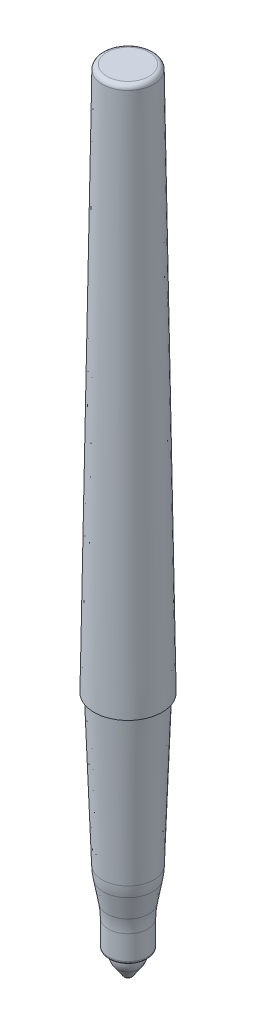
ISO-10303-21;
HEADER;
FILE_DESCRIPTION(('STEP AP214'),'2;1');
FILE_NAME('part.step','',(''),(''),'','','');
FILE_SCHEMA(('AUTOMOTIVE_DESIGN { 1 0 10303 214 1 1 1 1 }'));
ENDSEC;
DATA;
#1=APPLICATION_CONTEXT('core data for automotive mechanical design processes');
#2=APPLICATION_PROTOCOL_DEFINITION('international standard','automotive_design',2000,#1);
#3=PRODUCT_CONTEXT('',#1,'mechanical');
#4=PRODUCT('Part','Part','',(#3));
#5=PRODUCT_RELATED_PRODUCT_CATEGORY('part','',(#4));
#6=PRODUCT_DEFINITION_FORMATION('','',#4);
#7=PRODUCT_DEFINITION_CONTEXT('part definition',#1,'design');
#8=PRODUCT_DEFINITION('design','',#6,#7);
#9=PRODUCT_DEFINITION_SHAPE('','',#8);
#10=(LENGTH_UNIT() NAMED_UNIT(*) SI_UNIT(.MILLI.,.METRE.));
#11=(NAMED_UNIT(*) PLANE_ANGLE_UNIT() SI_UNIT($,.RADIAN.));
#12=(NAMED_UNIT(*) SI_UNIT($,.STERADIAN.) SOLID_ANGLE_UNIT());
#13=UNCERTAINTY_MEASURE_WITH_UNIT(LENGTH_MEASURE(1.E-05),#10,'distance_accuracy_value','');
#14=(GEOMETRIC_REPRESENTATION_CONTEXT(3) GLOBAL_UNCERTAINTY_ASSIGNED_CONTEXT((#13)) GLOBAL_UNIT_ASSIGNED_CONTEXT((#10,
#11,#12)) REPRESENTATION_CONTEXT('',''));
#15=CARTESIAN_POINT('',(0.,0.,0.));
#16=DIRECTION('',(0.,0.,1.));
#17=DIRECTION('',(1.,0.,0.));
#18=AXIS2_PLACEMENT_3D('',#15,#16,#17);
#19=CARTESIAN_POINT('',(0.,129.54,0.));
#20=DIRECTION('',(0.,-1.,0.));
#21=DIRECTION('',(0.,0.,-1.));
#22=AXIS2_PLACEMENT_3D('',#19,#20,#21);
#23=CONICAL_SURFACE('',#22,4.191,0.0156459493613127);
#24=CARTESIAN_POINT('',(0.,128.789921727001,0.));
#25=DIRECTION('',(0.,1.,0.));
#26=DIRECTION('',(0.,0.,1.));
#27=AXIS2_PLACEMENT_3D('',#24,#25,#26);
#28=CIRCLE('',#27,4.20273664438547);
#29=CARTESIAN_POINT('',(0.,128.789921727001,4.20273664438547));
#30=VERTEX_POINT('',#29);
#31=EDGE_CURVE('E39',#30,#30,#28,.F.);
#32=ORIENTED_EDGE('',*,*,#31,.T.);
#33=EDGE_LOOP('',(#32));
#34=FACE_BOUND('',#33,.T.);
#35=CARTESIAN_POINT('',(0.,40.259,0.));
#36=DIRECTION('',(0.,-1.,0.));
#37=DIRECTION('',(0.,0.,-1.));
#38=AXIS2_PLACEMENT_3D('',#35,#36,#37);
#39=CIRCLE('',#38,5.588);
#40=CARTESIAN_POINT('',(0.,40.259,-5.588));
#41=VERTEX_POINT('',#40);
#42=EDGE_CURVE('E82',#41,#41,#39,.T.);
#43=ORIENTED_EDGE('',*,*,#42,.F.);
#44=EDGE_LOOP('',(#43));
#45=FACE_BOUND('',#44,.T.);
#46=ADVANCED_FACE('F32',(#34,#45),#23,.T.);
#47=CARTESIAN_POINT('',(0.,129.54,0.));
#48=DIRECTION('',(0.,-1.,0.));
#49=DIRECTION('',(0.,0.,-1.));
#50=AXIS2_PLACEMENT_3D('',#47,#48,#49);
#51=PLANE('',#50);
#52=CARTESIAN_POINT('',(0.,129.54,0.));
#53=DIRECTION('',(0.,-1.,0.));
#54=DIRECTION('',(0.,0.,-1.));
#55=AXIS2_PLACEMENT_3D('',#52,#53,#54);
#56=CIRCLE('',#55,3.44082990965654);
#57=CARTESIAN_POINT('',(0.,129.54,-3.44082990965654));
#58=VERTEX_POINT('',#57);
#59=EDGE_CURVE('E10',#58,#58,#56,.F.);
#60=ORIENTED_EDGE('',*,*,#59,.T.);
#61=EDGE_LOOP('',(#60));
#62=FACE_BOUND('',#61,.T.);
#63=ADVANCED_FACE('F90',(#62),#51,.F.);
#64=CARTESIAN_POINT('',(0.,0.,0.));
#65=DIRECTION('',(0.,-1.,0.));
#66=DIRECTION('',(0.,0.,-1.));
#67=AXIS2_PLACEMENT_3D('',#64,#65,#66);
#68=PLANE('',#67);
#69=CARTESIAN_POINT('',(0.,0.,0.));
#70=DIRECTION('',(0.,-1.,0.));
#71=DIRECTION('',(0.,0.,-1.));
#72=AXIS2_PLACEMENT_3D('',#69,#70,#71);
#73=CIRCLE('',#72,0.243506974720728);
#74=CARTESIAN_POINT('',(0.,0.,-0.243506974720728));
#75=VERTEX_POINT('',#74);
#76=EDGE_CURVE('E73',#75,#75,#73,.T.);
#77=ORIENTED_EDGE('',*,*,#76,.T.);
#78=EDGE_LOOP('',(#77));
#79=FACE_BOUND('',#78,.T.);
#80=ADVANCED_FACE('F95',(#79),#68,.T.);
#81=CARTESIAN_POINT('',(0.,0.,0.));
#82=DIRECTION('',(0.,1.,0.));
#83=DIRECTION('',(0.,0.,1.));
#84=AXIS2_PLACEMENT_3D('',#81,#82,#83);
#85=CONICAL_SURFACE('',#84,0.508,0.610725964389209);
#86=CARTESIAN_POINT('',(0.,1.88407011159766,0.));
#87=DIRECTION('',(0.,-1.,0.));
#88=DIRECTION('',(0.,0.,-1.));
#89=AXIS2_PLACEMENT_3D('',#86,#87,#88);
#90=CIRCLE('',#89,1.82684907811836);
#91=CARTESIAN_POINT('',(0.,1.88407011159766,-1.82684907811836));
#92=VERTEX_POINT('',#91);
#93=EDGE_CURVE('E67',#92,#92,#90,.T.);
#94=ORIENTED_EDGE('',*,*,#93,.T.);
#95=EDGE_LOOP('',(#94));
#96=FACE_BOUND('',#95,.T.);
#97=CARTESIAN_POINT('',(0.,0.216681129063429,0.));
#98=DIRECTION('',(0.,-1.,0.));
#99=DIRECTION('',(0.,0.,-1.));
#100=AXIS2_PLACEMENT_3D('',#97,#98,#99);
#101=CIRCLE('',#100,0.659676790344401);
#102=CARTESIAN_POINT('',(0.,0.216681129063429,-0.659676790344401));
#103=VERTEX_POINT('',#102);
#104=EDGE_CURVE('E70',#103,#103,#101,.F.);
#105=ORIENTED_EDGE('',*,*,#104,.T.);
#106=EDGE_LOOP('',(#105));
#107=FACE_BOUND('',#106,.T.);
#108=ADVANCED_FACE('F134',(#96,#107),#85,.T.);
#109=CARTESIAN_POINT('',(0.,0.,0.));
#110=DIRECTION('',(0.,-1.,0.));
#111=DIRECTION('',(0.,0.,-1.));
#112=AXIS2_PLACEMENT_3D('',#109,#110,#111);
#113=CYLINDRICAL_SURFACE('',#112,2.286);
#114=CARTESIAN_POINT('',(0.,3.34066446628052,0.));
#115=DIRECTION('',(0.,1.,0.));
#116=DIRECTION('',(0.,0.,1.));
#117=AXIS2_PLACEMENT_3D('',#114,#115,#116);
#118=CIRCLE('',#117,2.286);
#119=CARTESIAN_POINT('',(0.,3.34066446628052,2.286));
#120=VERTEX_POINT('',#119);
#121=EDGE_CURVE('E64',#120,#120,#118,.T.);
#122=ORIENTED_EDGE('',*,*,#121,.T.);
#123=EDGE_LOOP('',(#122));
#124=FACE_BOUND('',#123,.T.);
#125=CARTESIAN_POINT('',(0.,3.81,0.));
#126=DIRECTION('',(0.,-1.,0.));
#127=DIRECTION('',(0.,0.,-1.));
#128=AXIS2_PLACEMENT_3D('',#125,#126,#127);
#129=CIRCLE('',#128,2.286);
#130=CARTESIAN_POINT('',(0.,3.81,-2.286));
#131=VERTEX_POINT('',#130);
#132=EDGE_CURVE('E76',#131,#131,#129,.T.);
#133=ORIENTED_EDGE('',*,*,#132,.T.);
#134=EDGE_LOOP('',(#133));
#135=FACE_BOUND('',#134,.T.);
#136=ADVANCED_FACE('F129',(#124,#135),#113,.T.);
#137=CARTESIAN_POINT('',(0.,3.81,0.));
#138=DIRECTION('',(0.,-1.,0.));
#139=DIRECTION('',(0.,0.,-1.));
#140=AXIS2_PLACEMENT_3D('',#137,#138,#139);
#141=PLANE('',#140);
#142=CARTESIAN_POINT('',(0.,3.81,0.));
#143=DIRECTION('',(0.,-1.,0.));
#144=DIRECTION('',(0.,0.,-1.));
#145=AXIS2_PLACEMENT_3D('',#142,#143,#144);
#146=CIRCLE('',#145,2.7051);
#147=CARTESIAN_POINT('',(0.,3.81,-2.7051));
#148=VERTEX_POINT('',#147);
#149=EDGE_CURVE('E47',#148,#148,#146,.T.);
#150=ORIENTED_EDGE('',*,*,#149,.T.);
#151=EDGE_LOOP('',(#150));
#152=FACE_BOUND('',#151,.T.);
#153=ORIENTED_EDGE('',*,*,#132,.F.);
#154=EDGE_LOOP('',(#153));
#155=FACE_BOUND('',#154,.T.);
#156=ADVANCED_FACE('F125',(#152,#155),#141,.T.);
#157=CARTESIAN_POINT('',(0.,0.,0.));
#158=DIRECTION('',(0.,-1.,0.));
#159=DIRECTION('',(0.,0.,-1.));
#160=AXIS2_PLACEMENT_3D('',#157,#158,#159);
#161=CYLINDRICAL_SURFACE('',#160,3.2131);
#162=CARTESIAN_POINT('',(0.,4.318,0.));
#163=DIRECTION('',(0.,-1.,0.));
#164=DIRECTION('',(0.,0.,-1.));
#165=AXIS2_PLACEMENT_3D('',#162,#163,#164);
#166=CIRCLE('',#165,3.2131);
#167=CARTESIAN_POINT('',(0.,4.318,-3.2131));
#168=VERTEX_POINT('',#167);
#169=EDGE_CURVE('E43',#168,#168,#166,.F.);
#170=ORIENTED_EDGE('',*,*,#169,.T.);
#171=EDGE_LOOP('',(#170));
#172=FACE_BOUND('',#171,.T.);
#173=CARTESIAN_POINT('',(0.,8.26759405440986,0.));
#174=DIRECTION('',(0.,-1.,0.));
#175=DIRECTION('',(0.,0.,-1.));
#176=AXIS2_PLACEMENT_3D('',#173,#174,#175);
#177=CIRCLE('',#176,3.2131);
#178=CARTESIAN_POINT('',(0.,8.26759405440986,-3.2131));
#179=VERTEX_POINT('',#178);
#180=EDGE_CURVE('E52',#179,#179,#177,.T.);
#181=ORIENTED_EDGE('',*,*,#180,.T.);
#182=EDGE_LOOP('',(#181));
#183=FACE_BOUND('',#182,.T.);
#184=ADVANCED_FACE('F128',(#172,#183),#161,.T.);
#185=CARTESIAN_POINT('',(0.,9.398,0.));
#186=DIRECTION('',(0.,1.,0.));
#187=DIRECTION('',(0.,0.,1.));
#188=AXIS2_PLACEMENT_3D('',#185,#186,#187);
#189=CONICAL_SURFACE('',#188,3.2131,0.177548794944876);
#190=CARTESIAN_POINT('',(0.,13.9659464372444,0.));
#191=DIRECTION('',(0.,-1.,0.));
#192=DIRECTION('',(0.,0.,-1.));
#193=AXIS2_PLACEMENT_3D('',#190,#191,#192);
#194=CIRCLE('',#193,4.03276445838047);
#195=CARTESIAN_POINT('',(0.,13.9659464372444,-4.03276445838047));
#196=VERTEX_POINT('',#195);
#197=EDGE_CURVE('E58',#196,#196,#194,.T.);
#198=ORIENTED_EDGE('',*,*,#197,.T.);
#199=EDGE_LOOP('',(#198));
#200=FACE_BOUND('',#199,.T.);
#201=CARTESIAN_POINT('',(0.,10.5106354835664,0.));
#202=DIRECTION('',(0.,1.,0.));
#203=DIRECTION('',(0.,0.,1.));
#204=AXIS2_PLACEMENT_3D('',#201,#202,#203);
#205=CIRCLE('',#204,3.41274939903335);
#206=CARTESIAN_POINT('',(0.,10.5106354835664,3.41274939903335));
#207=VERTEX_POINT('',#206);
#208=EDGE_CURVE('E61',#207,#207,#205,.T.);
#209=ORIENTED_EDGE('',*,*,#208,.T.);
#210=EDGE_LOOP('',(#209));
#211=FACE_BOUND('',#210,.T.);
#212=ADVANCED_FACE('F176',(#200,#211),#189,.T.);
#213=CARTESIAN_POINT('',(0.,14.859,0.));
#214=DIRECTION('',(0.,1.,0.));
#215=DIRECTION('',(0.,0.,1.));
#216=AXIS2_PLACEMENT_3D('',#213,#214,#215);
#217=CONICAL_SURFACE('',#216,4.19301245490961,0.0349065850398867);
#218=CARTESIAN_POINT('',(0.,15.7657642582792,0.));
#219=DIRECTION('',(0.,-1.,0.));
#220=DIRECTION('',(0.,0.,-1.));
#221=AXIS2_PLACEMENT_3D('',#218,#219,#220);
#222=CIRCLE('',#221,4.22467736055633);
#223=CARTESIAN_POINT('',(0.,15.7657642582792,-4.22467736055633));
#224=VERTEX_POINT('',#223);
#225=EDGE_CURVE('E55',#224,#224,#222,.F.);
#226=ORIENTED_EDGE('',*,*,#225,.T.);
#227=EDGE_LOOP('',(#226));
#228=FACE_BOUND('',#227,.T.);
#229=CARTESIAN_POINT('',(0.,40.259,0.));
#230=DIRECTION('',(0.,-1.,0.));
#231=DIRECTION('',(0.,0.,-1.));
#232=AXIS2_PLACEMENT_3D('',#229,#230,#231);
#233=CIRCLE('',#232,5.08);
#234=CARTESIAN_POINT('',(0.,40.259,-5.08));
#235=VERTEX_POINT('',#234);
#236=EDGE_CURVE('E79',#235,#235,#233,.T.);
#237=ORIENTED_EDGE('',*,*,#236,.T.);
#238=EDGE_LOOP('',(#237));
#239=FACE_BOUND('',#238,.T.);
#240=ADVANCED_FACE('F181',(#228,#239),#217,.T.);
#241=CARTESIAN_POINT('',(0.,40.259,0.));
#242=DIRECTION('',(0.,-1.,0.));
#243=DIRECTION('',(0.,0.,-1.));
#244=AXIS2_PLACEMENT_3D('',#241,#242,#243);
#245=PLANE('',#244);
#246=ORIENTED_EDGE('',*,*,#42,.T.);
#247=EDGE_LOOP('',(#246));
#248=FACE_BOUND('',#247,.T.);
#249=ORIENTED_EDGE('',*,*,#236,.F.);
#250=EDGE_LOOP('',(#249));
#251=FACE_BOUND('',#250,.T.);
#252=ADVANCED_FACE('F86',(#248,#251),#245,.T.);
#253=CARTESIAN_POINT('',(0.,0.508,0.));
#254=DIRECTION('',(0.,-1.,0.));
#255=DIRECTION('',(0.,0.,-1.));
#256=AXIS2_PLACEMENT_3D('',#253,#254,#255);
#257=DEGENERATE_TOROIDAL_SURFACE('',#256,0.243506974720728,0.508,.T.);
#258=ORIENTED_EDGE('',*,*,#104,.F.);
#259=EDGE_LOOP('',(#258));
#260=FACE_BOUND('',#259,.T.);
#261=ORIENTED_EDGE('',*,*,#76,.F.);
#262=EDGE_LOOP('',(#261));
#263=FACE_BOUND('',#262,.T.);
#264=ADVANCED_FACE('F99',(#260,#263),#257,.T.);
#265=CARTESIAN_POINT('',(0.,3.34066446628052,0.));
#266=DIRECTION('',(0.,1.,0.));
#267=DIRECTION('',(0.,0.,1.));
#268=AXIS2_PLACEMENT_3D('',#265,#266,#267);
#269=DEGENERATE_TOROIDAL_SURFACE('',#268,0.254,2.54,.F.);
#270=ORIENTED_EDGE('',*,*,#121,.F.);
#271=EDGE_LOOP('',(#270));
#272=FACE_BOUND('',#271,.T.);
#273=ORIENTED_EDGE('',*,*,#93,.F.);
#274=EDGE_LOOP('',(#273));
#275=FACE_BOUND('',#274,.T.);
#276=ADVANCED_FACE('F102',(#272,#275),#269,.F.);
#277=CARTESIAN_POINT('',(0.,16.2089878664009,0.));
#278=DIRECTION('',(0.,1.,0.));
#279=DIRECTION('',(0.,0.,1.));
#280=AXIS2_PLACEMENT_3D('',#277,#278,#279);
#281=DEGENERATE_TOROIDAL_SURFACE('',#280,8.46758614258619,12.7,.F.);
#282=ORIENTED_EDGE('',*,*,#225,.F.);
#283=EDGE_LOOP('',(#282));
#284=FACE_BOUND('',#283,.T.);
#285=ORIENTED_EDGE('',*,*,#197,.F.);
#286=EDGE_LOOP('',(#285));
#287=FACE_BOUND('',#286,.T.);
#288=ADVANCED_FACE('F106',(#284,#287),#281,.F.);
#289=CARTESIAN_POINT('',(0.,8.26759405440986,0.));
#290=DIRECTION('',(0.,-1.,0.));
#291=DIRECTION('',(0.,0.,-1.));
#292=AXIS2_PLACEMENT_3D('',#289,#290,#291);
#293=TOROIDAL_SURFACE('',#292,15.9131,12.7);
#294=ORIENTED_EDGE('',*,*,#208,.F.);
#295=EDGE_LOOP('',(#294));
#296=FACE_BOUND('',#295,.T.);
#297=ORIENTED_EDGE('',*,*,#180,.F.);
#298=EDGE_LOOP('',(#297));
#299=FACE_BOUND('',#298,.T.);
#300=ADVANCED_FACE('F110',(#296,#299),#293,.F.);
#301=CARTESIAN_POINT('',(0.,4.318,0.));
#302=DIRECTION('',(0.,-1.,0.));
#303=DIRECTION('',(0.,0.,-1.));
#304=AXIS2_PLACEMENT_3D('',#301,#302,#303);
#305=TOROIDAL_SURFACE('',#304,2.7051,0.508);
#306=ORIENTED_EDGE('',*,*,#169,.F.);
#307=EDGE_LOOP('',(#306));
#308=FACE_BOUND('',#307,.T.);
#309=ORIENTED_EDGE('',*,*,#149,.F.);
#310=EDGE_LOOP('',(#309));
#311=FACE_BOUND('',#310,.T.);
#312=ADVANCED_FACE('F113',(#308,#311),#305,.T.);
#313=CARTESIAN_POINT('',(0.,128.778,0.));
#314=DIRECTION('',(0.,-1.,0.));
#315=DIRECTION('',(0.,0.,-1.));
#316=AXIS2_PLACEMENT_3D('',#313,#314,#315);
#317=TOROIDAL_SURFACE('',#316,3.44082990965654,0.762);
#318=ORIENTED_EDGE('',*,*,#59,.F.);
#319=EDGE_LOOP('',(#318));
#320=FACE_BOUND('',#319,.T.);
#321=ORIENTED_EDGE('',*,*,#31,.F.);
#322=EDGE_LOOP('',(#321));
#323=FACE_BOUND('',#322,.T.);
#324=ADVANCED_FACE('F34',(#320,#323),#317,.T.);
#325=CLOSED_SHELL('',(#46,#63,#80,#108,#136,#156,#184,#212,#240,#252,#264,#276,#288,#300,#312,#324));
#326=MANIFOLD_SOLID_BREP('B2',#325);
#327=ADVANCED_BREP_SHAPE_REPRESENTATION('',(#18,#326),#14);
#328=SHAPE_DEFINITION_REPRESENTATION(#9,#327);
ENDSEC;
END-ISO-10303-21;
